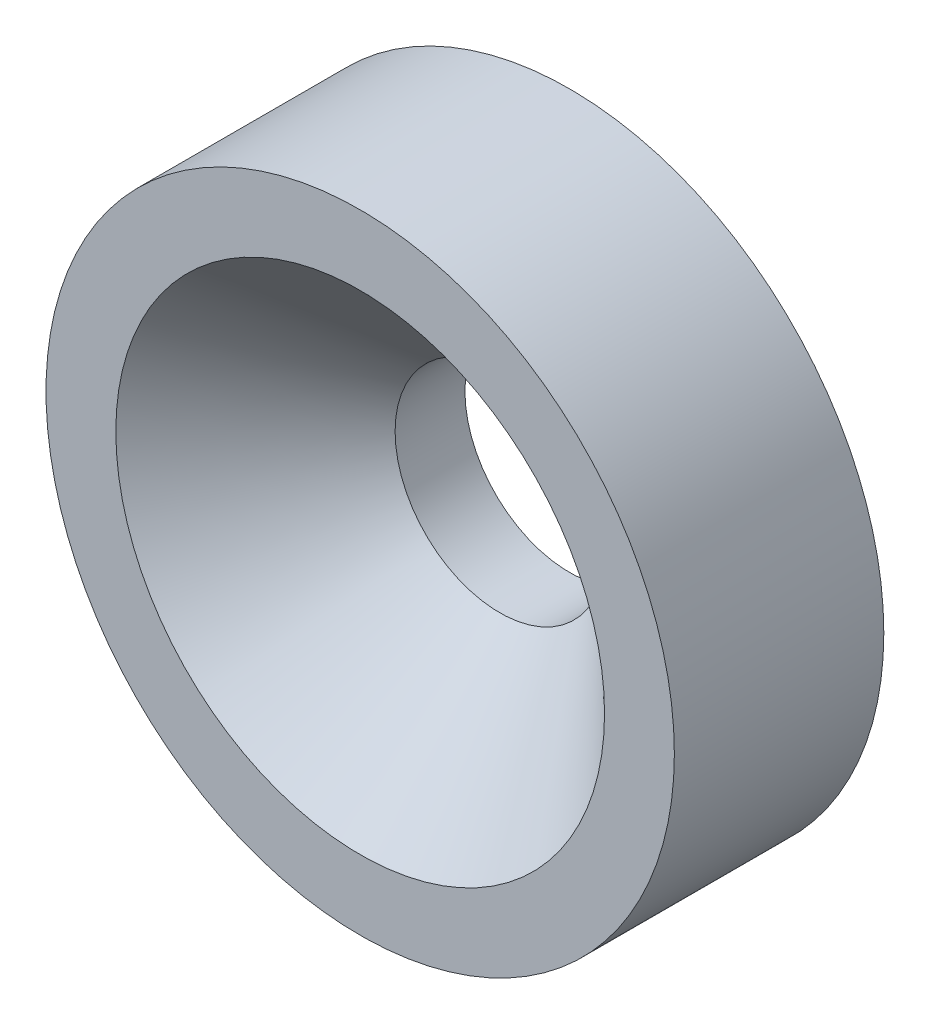
ISO-10303-21;
HEADER;
FILE_DESCRIPTION(('STEP AP214'),'2;1');
FILE_NAME('part.step','',(''),(''),'','','');
FILE_SCHEMA(('AUTOMOTIVE_DESIGN { 1 0 10303 214 1 1 1 1 }'));
ENDSEC;
DATA;
#1=APPLICATION_CONTEXT('core data for automotive mechanical design processes');
#2=APPLICATION_PROTOCOL_DEFINITION('international standard','automotive_design',2000,#1);
#3=PRODUCT_CONTEXT('',#1,'mechanical');
#4=PRODUCT('Part','Part','',(#3));
#5=PRODUCT_RELATED_PRODUCT_CATEGORY('part','',(#4));
#6=PRODUCT_DEFINITION_FORMATION('','',#4);
#7=PRODUCT_DEFINITION_CONTEXT('part definition',#1,'design');
#8=PRODUCT_DEFINITION('design','',#6,#7);
#9=PRODUCT_DEFINITION_SHAPE('','',#8);
#10=(LENGTH_UNIT() NAMED_UNIT(*) SI_UNIT(.MILLI.,.METRE.));
#11=(NAMED_UNIT(*) PLANE_ANGLE_UNIT() SI_UNIT($,.RADIAN.));
#12=(NAMED_UNIT(*) SI_UNIT($,.STERADIAN.) SOLID_ANGLE_UNIT());
#13=UNCERTAINTY_MEASURE_WITH_UNIT(LENGTH_MEASURE(1.E-05),#10,'distance_accuracy_value','');
#14=(GEOMETRIC_REPRESENTATION_CONTEXT(3) GLOBAL_UNCERTAINTY_ASSIGNED_CONTEXT((#13)) GLOBAL_UNIT_ASSIGNED_CONTEXT((#10,
#11,#12)) REPRESENTATION_CONTEXT('',''));
#15=CARTESIAN_POINT('',(0.,0.,0.));
#16=DIRECTION('',(0.,0.,1.));
#17=DIRECTION('',(1.,0.,0.));
#18=AXIS2_PLACEMENT_3D('',#15,#16,#17);
#19=CARTESIAN_POINT('',(0.,0.,3.));
#20=DIRECTION('',(0.,0.,1.));
#21=DIRECTION('',(1.,0.,0.));
#22=AXIS2_PLACEMENT_3D('',#19,#20,#21);
#23=PLANE('',#22);
#24=CARTESIAN_POINT('',(0.,0.,3.));
#25=DIRECTION('',(0.,0.,1.));
#26=DIRECTION('',(1.,0.,0.));
#27=AXIS2_PLACEMENT_3D('',#24,#25,#26);
#28=CIRCLE('',#27,3.50000000000001);
#29=CARTESIAN_POINT('',(3.50000000000001,0.,3.));
#30=VERTEX_POINT('',#29);
#31=EDGE_CURVE('E10',#30,#30,#28,.F.);
#32=ORIENTED_EDGE('',*,*,#31,.T.);
#33=EDGE_LOOP('',(#32));
#34=FACE_BOUND('',#33,.T.);
#35=CARTESIAN_POINT('',(0.,0.,3.));
#36=DIRECTION('',(0.,0.,1.));
#37=DIRECTION('',(1.,0.,0.));
#38=AXIS2_PLACEMENT_3D('',#35,#36,#37);
#39=CIRCLE('',#38,4.5);
#40=CARTESIAN_POINT('',(4.5,0.,3.));
#41=VERTEX_POINT('',#40);
#42=EDGE_CURVE('E51',#41,#41,#39,.T.);
#43=ORIENTED_EDGE('',*,*,#42,.T.);
#44=EDGE_LOOP('',(#43));
#45=FACE_BOUND('',#44,.T.);
#46=ADVANCED_FACE('F39',(#34,#45),#23,.T.);
#47=CARTESIAN_POINT('',(0.,0.,0.));
#48=DIRECTION('',(0.,0.,1.));
#49=DIRECTION('',(1.,0.,0.));
#50=AXIS2_PLACEMENT_3D('',#47,#48,#49);
#51=PLANE('',#50);
#52=CARTESIAN_POINT('',(0.,0.,0.));
#53=DIRECTION('',(0.,0.,1.));
#54=DIRECTION('',(1.,0.,0.));
#55=AXIS2_PLACEMENT_3D('',#52,#53,#54);
#56=CIRCLE('',#55,4.5);
#57=CARTESIAN_POINT('',(4.5,0.,0.));
#58=VERTEX_POINT('',#57);
#59=EDGE_CURVE('E55',#58,#58,#56,.T.);
#60=ORIENTED_EDGE('',*,*,#59,.F.);
#61=EDGE_LOOP('',(#60));
#62=FACE_BOUND('',#61,.T.);
#63=CARTESIAN_POINT('',(0.,0.,0.));
#64=DIRECTION('',(0.,0.,1.));
#65=DIRECTION('',(1.,0.,0.));
#66=AXIS2_PLACEMENT_3D('',#63,#64,#65);
#67=CIRCLE('',#66,1.5);
#68=CARTESIAN_POINT('',(1.5,0.,0.));
#69=VERTEX_POINT('',#68);
#70=EDGE_CURVE('E59',#69,#69,#67,.T.);
#71=ORIENTED_EDGE('',*,*,#70,.T.);
#72=EDGE_LOOP('',(#71));
#73=FACE_BOUND('',#72,.T.);
#74=ADVANCED_FACE('F64',(#62,#73),#51,.F.);
#75=CARTESIAN_POINT('',(0.,0.,3.));
#76=DIRECTION('',(0.,0.,-1.));
#77=DIRECTION('',(-1.,0.,0.));
#78=AXIS2_PLACEMENT_3D('',#75,#76,#77);
#79=CYLINDRICAL_SURFACE('',#78,4.5);
#80=ORIENTED_EDGE('',*,*,#42,.F.);
#81=EDGE_LOOP('',(#80));
#82=FACE_BOUND('',#81,.T.);
#83=ORIENTED_EDGE('',*,*,#59,.T.);
#84=EDGE_LOOP('',(#83));
#85=FACE_BOUND('',#84,.T.);
#86=ADVANCED_FACE('F68',(#82,#85),#79,.T.);
#87=CARTESIAN_POINT('',(0.,0.,3.));
#88=DIRECTION('',(0.,0.,-1.));
#89=DIRECTION('',(-1.,0.,0.));
#90=AXIS2_PLACEMENT_3D('',#87,#88,#89);
#91=CYLINDRICAL_SURFACE('',#90,1.5);
#92=CARTESIAN_POINT('',(0.,0.,0.999999999999992));
#93=DIRECTION('',(0.,0.,1.));
#94=DIRECTION('',(1.,0.,0.));
#95=AXIS2_PLACEMENT_3D('',#92,#93,#94);
#96=CIRCLE('',#95,1.5);
#97=CARTESIAN_POINT('',(1.5,0.,0.999999999999992));
#98=VERTEX_POINT('',#97);
#99=EDGE_CURVE('E47',#98,#98,#96,.T.);
#100=ORIENTED_EDGE('',*,*,#99,.T.);
#101=EDGE_LOOP('',(#100));
#102=FACE_BOUND('',#101,.T.);
#103=ORIENTED_EDGE('',*,*,#70,.F.);
#104=EDGE_LOOP('',(#103));
#105=FACE_BOUND('',#104,.T.);
#106=ADVANCED_FACE('F66',(#102,#105),#91,.F.);
#107=CARTESIAN_POINT('',(0.,0.,0.999999999999992));
#108=DIRECTION('',(0.,0.,1.));
#109=DIRECTION('',(1.,0.,0.));
#110=AXIS2_PLACEMENT_3D('',#107,#108,#109);
#111=CONICAL_SURFACE('',#110,1.5,0.785398163397448);
#112=ORIENTED_EDGE('',*,*,#31,.F.);
#113=EDGE_LOOP('',(#112));
#114=FACE_BOUND('',#113,.T.);
#115=ORIENTED_EDGE('',*,*,#99,.F.);
#116=EDGE_LOOP('',(#115));
#117=FACE_BOUND('',#116,.T.);
#118=ADVANCED_FACE('F42',(#114,#117),#111,.F.);
#119=CLOSED_SHELL('',(#46,#74,#86,#106,#118));
#120=MANIFOLD_SOLID_BREP('B2',#119);
#121=ADVANCED_BREP_SHAPE_REPRESENTATION('',(#18,#120),#14);
#122=SHAPE_DEFINITION_REPRESENTATION(#9,#121);
ENDSEC;
END-ISO-10303-21;
